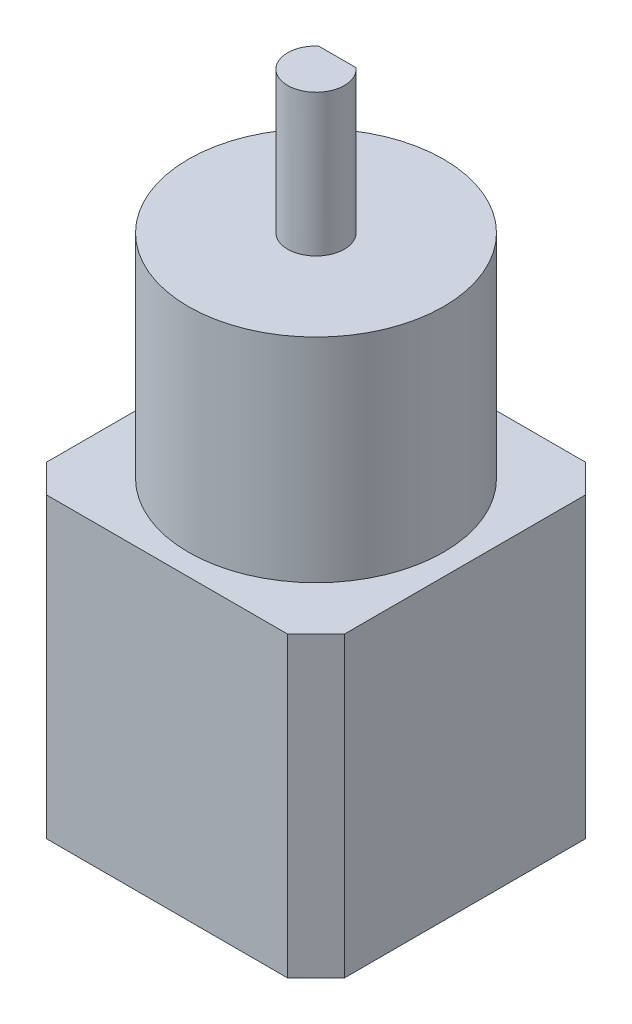
ISO-10303-21;
HEADER;
FILE_DESCRIPTION(('STEP AP214'),'2;1');
FILE_NAME('part.step','',(''),(''),'','','');
FILE_SCHEMA(('AUTOMOTIVE_DESIGN { 1 0 10303 214 1 1 1 1 }'));
ENDSEC;
DATA;
#1=APPLICATION_CONTEXT('core data for automotive mechanical design processes');
#2=APPLICATION_PROTOCOL_DEFINITION('international standard','automotive_design',2000,#1);
#3=PRODUCT_CONTEXT('',#1,'mechanical');
#4=PRODUCT('Part','Part','',(#3));
#5=PRODUCT_RELATED_PRODUCT_CATEGORY('part','',(#4));
#6=PRODUCT_DEFINITION_FORMATION('','',#4);
#7=PRODUCT_DEFINITION_CONTEXT('part definition',#1,'design');
#8=PRODUCT_DEFINITION('design','',#6,#7);
#9=PRODUCT_DEFINITION_SHAPE('','',#8);
#10=(LENGTH_UNIT() NAMED_UNIT(*) SI_UNIT(.MILLI.,.METRE.));
#11=(NAMED_UNIT(*) PLANE_ANGLE_UNIT() SI_UNIT($,.RADIAN.));
#12=(NAMED_UNIT(*) SI_UNIT($,.STERADIAN.) SOLID_ANGLE_UNIT());
#13=UNCERTAINTY_MEASURE_WITH_UNIT(LENGTH_MEASURE(1.E-05),#10,'distance_accuracy_value','');
#14=(GEOMETRIC_REPRESENTATION_CONTEXT(3) GLOBAL_UNCERTAINTY_ASSIGNED_CONTEXT((#13)) GLOBAL_UNIT_ASSIGNED_CONTEXT((#10,
#11,#12)) REPRESENTATION_CONTEXT('',''));
#15=CARTESIAN_POINT('',(0.,0.,0.));
#16=DIRECTION('',(0.,0.,1.));
#17=DIRECTION('',(1.,0.,0.));
#18=AXIS2_PLACEMENT_3D('',#15,#16,#17);
#19=CARTESIAN_POINT('',(21.,21.,21.));
#20=DIRECTION('',(-1.,0.,0.));
#21=DIRECTION('',(0.,0.,1.));
#22=AXIS2_PLACEMENT_3D('',#19,#20,#21);
#23=PLANE('',#22);
#24=DIRECTION('',(0.,0.,-1.));
#25=VECTOR('',#24,1.);
#26=CARTESIAN_POINT('',(21.,-21.,21.));
#27=LINE('',#26,#25);
#28=CARTESIAN_POINT('',(21.,-21.,17.));
#29=VERTEX_POINT('',#28);
#30=CARTESIAN_POINT('',(21.,-21.,-17.));
#31=VERTEX_POINT('',#30);
#32=EDGE_CURVE('E144',#29,#31,#27,.T.);
#33=ORIENTED_EDGE('',*,*,#32,.T.);
#34=DIRECTION('',(0.,1.,0.));
#35=VECTOR('',#34,1.);
#36=CARTESIAN_POINT('',(21.,21.,-17.));
#37=LINE('',#36,#35);
#38=CARTESIAN_POINT('',(21.,21.,-17.));
#39=VERTEX_POINT('',#38);
#40=EDGE_CURVE('E197',#31,#39,#37,.T.);
#41=ORIENTED_EDGE('',*,*,#40,.T.);
#42=DIRECTION('',(0.,0.,-1.));
#43=VECTOR('',#42,1.);
#44=CARTESIAN_POINT('',(21.,21.,21.));
#45=LINE('',#44,#43);
#46=CARTESIAN_POINT('',(21.,21.,17.));
#47=VERTEX_POINT('',#46);
#48=EDGE_CURVE('E147',#47,#39,#45,.T.);
#49=ORIENTED_EDGE('',*,*,#48,.F.);
#50=DIRECTION('',(0.,-1.,0.));
#51=VECTOR('',#50,1.);
#52=CARTESIAN_POINT('',(21.,21.,17.));
#53=LINE('',#52,#51);
#54=EDGE_CURVE('E194',#47,#29,#53,.T.);
#55=ORIENTED_EDGE('',*,*,#54,.T.);
#56=EDGE_LOOP('',(#33,#41,#49,#55));
#57=FACE_BOUND('',#56,.T.);
#58=ADVANCED_FACE('F38',(#57),#23,.F.);
#59=CARTESIAN_POINT('',(-21.,21.,-21.));
#60=DIRECTION('',(0.,0.,1.));
#61=DIRECTION('',(1.,0.,0.));
#62=AXIS2_PLACEMENT_3D('',#59,#60,#61);
#63=PLANE('',#62);
#64=DIRECTION('',(-1.,0.,0.));
#65=VECTOR('',#64,1.);
#66=CARTESIAN_POINT('',(-21.,-21.,-21.));
#67=LINE('',#66,#65);
#68=CARTESIAN_POINT('',(17.,-21.,-21.));
#69=VERTEX_POINT('',#68);
#70=CARTESIAN_POINT('',(-17.,-21.,-21.));
#71=VERTEX_POINT('',#70);
#72=EDGE_CURVE('E162',#69,#71,#67,.T.);
#73=ORIENTED_EDGE('',*,*,#72,.T.);
#74=DIRECTION('',(0.,1.,0.));
#75=VECTOR('',#74,1.);
#76=CARTESIAN_POINT('',(-17.,21.,-21.));
#77=LINE('',#76,#75);
#78=CARTESIAN_POINT('',(-17.,21.,-21.));
#79=VERTEX_POINT('',#78);
#80=EDGE_CURVE('E184',#71,#79,#77,.T.);
#81=ORIENTED_EDGE('',*,*,#80,.T.);
#82=DIRECTION('',(-1.,0.,0.));
#83=VECTOR('',#82,1.);
#84=CARTESIAN_POINT('',(-21.,21.,-21.));
#85=LINE('',#84,#83);
#86=CARTESIAN_POINT('',(17.,21.,-21.));
#87=VERTEX_POINT('',#86);
#88=EDGE_CURVE('E150',#87,#79,#85,.T.);
#89=ORIENTED_EDGE('',*,*,#88,.F.);
#90=DIRECTION('',(0.,-1.,0.));
#91=VECTOR('',#90,1.);
#92=CARTESIAN_POINT('',(17.,21.,-21.));
#93=LINE('',#92,#91);
#94=EDGE_CURVE('E181',#87,#69,#93,.T.);
#95=ORIENTED_EDGE('',*,*,#94,.T.);
#96=EDGE_LOOP('',(#73,#81,#89,#95));
#97=FACE_BOUND('',#96,.T.);
#98=ADVANCED_FACE('F223',(#97),#63,.F.);
#99=CARTESIAN_POINT('',(-21.,21.,21.));
#100=DIRECTION('',(1.,0.,0.));
#101=DIRECTION('',(0.,0.,-1.));
#102=AXIS2_PLACEMENT_3D('',#99,#100,#101);
#103=PLANE('',#102);
#104=DIRECTION('',(0.,0.,1.));
#105=VECTOR('',#104,1.);
#106=CARTESIAN_POINT('',(-21.,21.,21.));
#107=LINE('',#106,#105);
#108=CARTESIAN_POINT('',(-21.,21.,-17.));
#109=VERTEX_POINT('',#108);
#110=CARTESIAN_POINT('',(-21.,21.,17.));
#111=VERTEX_POINT('',#110);
#112=EDGE_CURVE('E154',#109,#111,#107,.T.);
#113=ORIENTED_EDGE('',*,*,#112,.F.);
#114=DIRECTION('',(0.,-1.,0.));
#115=VECTOR('',#114,1.);
#116=CARTESIAN_POINT('',(-21.,21.,-17.));
#117=LINE('',#116,#115);
#118=CARTESIAN_POINT('',(-21.,-21.,-17.));
#119=VERTEX_POINT('',#118);
#120=EDGE_CURVE('E170',#109,#119,#117,.T.);
#121=ORIENTED_EDGE('',*,*,#120,.T.);
#122=DIRECTION('',(0.,0.,1.));
#123=VECTOR('',#122,1.);
#124=CARTESIAN_POINT('',(-21.,-21.,21.));
#125=LINE('',#124,#123);
#126=CARTESIAN_POINT('',(-21.,-21.,17.));
#127=VERTEX_POINT('',#126);
#128=EDGE_CURVE('E165',#119,#127,#125,.T.);
#129=ORIENTED_EDGE('',*,*,#128,.T.);
#130=DIRECTION('',(0.,1.,0.));
#131=VECTOR('',#130,1.);
#132=CARTESIAN_POINT('',(-21.,21.,17.));
#133=LINE('',#132,#131);
#134=EDGE_CURVE('E159',#127,#111,#133,.T.);
#135=ORIENTED_EDGE('',*,*,#134,.T.);
#136=EDGE_LOOP('',(#113,#121,#129,#135));
#137=FACE_BOUND('',#136,.T.);
#138=ADVANCED_FACE('F231',(#137),#103,.F.);
#139=CARTESIAN_POINT('',(-21.,21.,21.));
#140=DIRECTION('',(0.,0.,-1.));
#141=DIRECTION('',(-1.,0.,0.));
#142=AXIS2_PLACEMENT_3D('',#139,#140,#141);
#143=PLANE('',#142);
#144=DIRECTION('',(1.,0.,0.));
#145=VECTOR('',#144,1.);
#146=CARTESIAN_POINT('',(-21.,21.,21.));
#147=LINE('',#146,#145);
#148=CARTESIAN_POINT('',(-17.,21.,21.));
#149=VERTEX_POINT('',#148);
#150=CARTESIAN_POINT('',(17.,21.,21.));
#151=VERTEX_POINT('',#150);
#152=EDGE_CURVE('E157',#149,#151,#147,.T.);
#153=ORIENTED_EDGE('',*,*,#152,.F.);
#154=DIRECTION('',(0.,-1.,0.));
#155=VECTOR('',#154,1.);
#156=CARTESIAN_POINT('',(-17.,21.,21.));
#157=LINE('',#156,#155);
#158=CARTESIAN_POINT('',(-17.,-21.,21.));
#159=VERTEX_POINT('',#158);
#160=EDGE_CURVE('E43',#149,#159,#157,.T.);
#161=ORIENTED_EDGE('',*,*,#160,.T.);
#162=DIRECTION('',(1.,0.,0.));
#163=VECTOR('',#162,1.);
#164=CARTESIAN_POINT('',(-21.,-21.,21.));
#165=LINE('',#164,#163);
#166=CARTESIAN_POINT('',(17.,-21.,21.));
#167=VERTEX_POINT('',#166);
#168=EDGE_CURVE('E151',#159,#167,#165,.T.);
#169=ORIENTED_EDGE('',*,*,#168,.T.);
#170=DIRECTION('',(0.,1.,0.));
#171=VECTOR('',#170,1.);
#172=CARTESIAN_POINT('',(17.,21.,21.));
#173=LINE('',#172,#171);
#174=EDGE_CURVE('E64',#167,#151,#173,.T.);
#175=ORIENTED_EDGE('',*,*,#174,.T.);
#176=EDGE_LOOP('',(#153,#161,#169,#175));
#177=FACE_BOUND('',#176,.T.);
#178=ADVANCED_FACE('F201',(#177),#143,.F.);
#179=CARTESIAN_POINT('',(0.,21.,0.));
#180=DIRECTION('',(0.,-1.,0.));
#181=DIRECTION('',(0.,0.,-1.));
#182=AXIS2_PLACEMENT_3D('',#179,#180,#181);
#183=PLANE('',#182);
#184=CARTESIAN_POINT('',(0.,21.,0.));
#185=DIRECTION('',(0.,1.,0.));
#186=DIRECTION('',(0.,0.,1.));
#187=AXIS2_PLACEMENT_3D('',#184,#185,#186);
#188=CIRCLE('',#187,18.);
#189=CARTESIAN_POINT('',(0.,21.,18.));
#190=VERTEX_POINT('',#189);
#191=EDGE_CURVE('E48',#190,#190,#188,.T.);
#192=ORIENTED_EDGE('',*,*,#191,.F.);
#193=EDGE_LOOP('',(#192));
#194=FACE_BOUND('',#193,.T.);
#195=ORIENTED_EDGE('',*,*,#88,.T.);
#196=DIRECTION('',(0.707106781186549,0.,-0.707106781186546));
#197=VECTOR('',#196,1.);
#198=CARTESIAN_POINT('',(-21.,21.,-17.));
#199=LINE('',#198,#197);
#200=EDGE_CURVE('E192',#79,#109,#199,.F.);
#201=ORIENTED_EDGE('',*,*,#200,.T.);
#202=ORIENTED_EDGE('',*,*,#112,.T.);
#203=DIRECTION('',(-0.707106781186546,0.,-0.707106781186549));
#204=VECTOR('',#203,1.);
#205=CARTESIAN_POINT('',(-17.,21.,21.));
#206=LINE('',#205,#204);
#207=EDGE_CURVE('E188',#111,#149,#206,.F.);
#208=ORIENTED_EDGE('',*,*,#207,.T.);
#209=ORIENTED_EDGE('',*,*,#152,.T.);
#210=DIRECTION('',(-0.707106781186548,0.,0.707106781186547));
#211=VECTOR('',#210,1.);
#212=CARTESIAN_POINT('',(21.,21.,17.));
#213=LINE('',#212,#211);
#214=EDGE_CURVE('E186',#151,#47,#213,.F.);
#215=ORIENTED_EDGE('',*,*,#214,.T.);
#216=ORIENTED_EDGE('',*,*,#48,.T.);
#217=DIRECTION('',(0.707106781186546,0.,0.707106781186549));
#218=VECTOR('',#217,1.);
#219=CARTESIAN_POINT('',(17.,21.,-21.));
#220=LINE('',#219,#218);
#221=EDGE_CURVE('E190',#39,#87,#220,.F.);
#222=ORIENTED_EDGE('',*,*,#221,.T.);
#223=EDGE_LOOP('',(#195,#201,#202,#208,#209,#215,#216,#222));
#224=FACE_BOUND('',#223,.T.);
#225=ADVANCED_FACE('F216',(#194,#224),#183,.F.);
#226=CARTESIAN_POINT('',(0.,-21.,0.));
#227=DIRECTION('',(0.,-1.,0.));
#228=DIRECTION('',(0.,0.,-1.));
#229=AXIS2_PLACEMENT_3D('',#226,#227,#228);
#230=PLANE('',#229);
#231=ORIENTED_EDGE('',*,*,#128,.F.);
#232=DIRECTION('',(-0.707106781186549,0.,0.707106781186546));
#233=VECTOR('',#232,1.);
#234=CARTESIAN_POINT('',(-19.,-21.,-19.));
#235=LINE('',#234,#233);
#236=EDGE_CURVE('E179',#119,#71,#235,.F.);
#237=ORIENTED_EDGE('',*,*,#236,.T.);
#238=ORIENTED_EDGE('',*,*,#72,.F.);
#239=DIRECTION('',(-0.707106781186546,0.,-0.707106781186549));
#240=VECTOR('',#239,1.);
#241=CARTESIAN_POINT('',(19.,-21.,-18.9999999999999));
#242=LINE('',#241,#240);
#243=EDGE_CURVE('E177',#69,#31,#242,.F.);
#244=ORIENTED_EDGE('',*,*,#243,.T.);
#245=ORIENTED_EDGE('',*,*,#32,.F.);
#246=DIRECTION('',(0.707106781186548,0.,-0.707106781186547));
#247=VECTOR('',#246,1.);
#248=CARTESIAN_POINT('',(19.,-21.,19.));
#249=LINE('',#248,#247);
#250=EDGE_CURVE('E173',#29,#167,#249,.F.);
#251=ORIENTED_EDGE('',*,*,#250,.T.);
#252=ORIENTED_EDGE('',*,*,#168,.F.);
#253=DIRECTION('',(0.707106781186546,0.,0.707106781186549));
#254=VECTOR('',#253,1.);
#255=CARTESIAN_POINT('',(-19.,-21.,19.));
#256=LINE('',#255,#254);
#257=EDGE_CURVE('E175',#159,#127,#256,.F.);
#258=ORIENTED_EDGE('',*,*,#257,.T.);
#259=EDGE_LOOP('',(#231,#237,#238,#244,#245,#251,#252,#258));
#260=FACE_BOUND('',#259,.T.);
#261=ADVANCED_FACE('F206',(#260),#230,.T.);
#262=CARTESIAN_POINT('',(-21.,21.,-17.));
#263=DIRECTION('',(0.707106781186546,0.,0.707106781186549));
#264=DIRECTION('',(0.,-1.,0.));
#265=AXIS2_PLACEMENT_3D('',#262,#263,#264);
#266=PLANE('',#265);
#267=ORIENTED_EDGE('',*,*,#200,.F.);
#268=ORIENTED_EDGE('',*,*,#80,.F.);
#269=ORIENTED_EDGE('',*,*,#236,.F.);
#270=ORIENTED_EDGE('',*,*,#120,.F.);
#271=EDGE_LOOP('',(#267,#268,#269,#270));
#272=FACE_BOUND('',#271,.T.);
#273=ADVANCED_FACE('F228',(#272),#266,.F.);
#274=CARTESIAN_POINT('',(17.,21.,-21.));
#275=DIRECTION('',(-0.707106781186549,0.,0.707106781186546));
#276=DIRECTION('',(0.,-1.,0.));
#277=AXIS2_PLACEMENT_3D('',#274,#275,#276);
#278=PLANE('',#277);
#279=ORIENTED_EDGE('',*,*,#221,.F.);
#280=ORIENTED_EDGE('',*,*,#40,.F.);
#281=ORIENTED_EDGE('',*,*,#243,.F.);
#282=ORIENTED_EDGE('',*,*,#94,.F.);
#283=EDGE_LOOP('',(#279,#280,#281,#282));
#284=FACE_BOUND('',#283,.T.);
#285=ADVANCED_FACE('F220',(#284),#278,.F.);
#286=CARTESIAN_POINT('',(-17.,21.,21.));
#287=DIRECTION('',(0.707106781186549,0.,-0.707106781186546));
#288=DIRECTION('',(0.,-1.,0.));
#289=AXIS2_PLACEMENT_3D('',#286,#287,#288);
#290=PLANE('',#289);
#291=ORIENTED_EDGE('',*,*,#207,.F.);
#292=ORIENTED_EDGE('',*,*,#134,.F.);
#293=ORIENTED_EDGE('',*,*,#257,.F.);
#294=ORIENTED_EDGE('',*,*,#160,.F.);
#295=EDGE_LOOP('',(#291,#292,#293,#294));
#296=FACE_BOUND('',#295,.T.);
#297=ADVANCED_FACE('F233',(#296),#290,.F.);
#298=CARTESIAN_POINT('',(21.,21.,17.));
#299=DIRECTION('',(-0.707106781186547,0.,-0.707106781186548));
#300=DIRECTION('',(0.,-1.,0.));
#301=AXIS2_PLACEMENT_3D('',#298,#299,#300);
#302=PLANE('',#301);
#303=ORIENTED_EDGE('',*,*,#214,.F.);
#304=ORIENTED_EDGE('',*,*,#174,.F.);
#305=ORIENTED_EDGE('',*,*,#250,.F.);
#306=ORIENTED_EDGE('',*,*,#54,.F.);
#307=EDGE_LOOP('',(#303,#304,#305,#306));
#308=FACE_BOUND('',#307,.T.);
#309=ADVANCED_FACE('F41',(#308),#302,.F.);
#310=CARTESIAN_POINT('',(0.,51.,0.));
#311=DIRECTION('',(0.,-1.,0.));
#312=DIRECTION('',(0.,0.,-1.));
#313=AXIS2_PLACEMENT_3D('',#310,#311,#312);
#314=CYLINDRICAL_SURFACE('',#313,18.);
#315=CARTESIAN_POINT('',(0.,51.,0.));
#316=DIRECTION('',(0.,1.,0.));
#317=DIRECTION('',(0.,0.,1.));
#318=AXIS2_PLACEMENT_3D('',#315,#316,#317);
#319=CIRCLE('',#318,18.);
#320=CARTESIAN_POINT('',(0.,51.,18.));
#321=VERTEX_POINT('',#320);
#322=EDGE_CURVE('E140',#321,#321,#319,.T.);
#323=ORIENTED_EDGE('',*,*,#322,.F.);
#324=EDGE_LOOP('',(#323));
#325=FACE_BOUND('',#324,.T.);
#326=ORIENTED_EDGE('',*,*,#191,.T.);
#327=EDGE_LOOP('',(#326));
#328=FACE_BOUND('',#327,.T.);
#329=ADVANCED_FACE('F239',(#325,#328),#314,.T.);
#330=CARTESIAN_POINT('',(0.,51.,0.));
#331=DIRECTION('',(0.,1.,0.));
#332=DIRECTION('',(0.,0.,1.));
#333=AXIS2_PLACEMENT_3D('',#330,#331,#332);
#334=PLANE('',#333);
#335=CARTESIAN_POINT('',(0.,51.,0.));
#336=DIRECTION('',(0.,1.,0.));
#337=DIRECTION('',(0.,0.,1.));
#338=AXIS2_PLACEMENT_3D('',#335,#336,#337);
#339=CIRCLE('',#338,4.);
#340=CARTESIAN_POINT('',(0.,51.,4.));
#341=VERTEX_POINT('',#340);
#342=EDGE_CURVE('E11',#341,#341,#339,.T.);
#343=ORIENTED_EDGE('',*,*,#342,.F.);
#344=EDGE_LOOP('',(#343));
#345=FACE_BOUND('',#344,.T.);
#346=ORIENTED_EDGE('',*,*,#322,.T.);
#347=EDGE_LOOP('',(#346));
#348=FACE_BOUND('',#347,.T.);
#349=ADVANCED_FACE('F299',(#345,#348),#334,.T.);
#350=CARTESIAN_POINT('',(0.,71.,0.));
#351=DIRECTION('',(0.,-1.,0.));
#352=DIRECTION('',(0.,0.,-1.));
#353=AXIS2_PLACEMENT_3D('',#350,#351,#352);
#354=CYLINDRICAL_SURFACE('',#353,4.);
#355=CARTESIAN_POINT('',(0.,71.,0.));
#356=DIRECTION('',(0.,1.,0.));
#357=DIRECTION('',(0.,0.,1.));
#358=AXIS2_PLACEMENT_3D('',#355,#356,#357);
#359=CIRCLE('',#358,4.);
#360=CARTESIAN_POINT('',(-2.64575131106459,71.,-3.));
#361=VERTEX_POINT('',#360);
#362=CARTESIAN_POINT('',(2.64575131106459,71.,-3.));
#363=VERTEX_POINT('',#362);
#364=EDGE_CURVE('E135',#361,#363,#359,.T.);
#365=ORIENTED_EDGE('',*,*,#364,.F.);
#366=DIRECTION('',(0.,1.,0.));
#367=VECTOR('',#366,1.);
#368=CARTESIAN_POINT('',(-2.64575131106459,56.,-3.));
#369=LINE('',#368,#367);
#370=CARTESIAN_POINT('',(-2.64575131106459,56.,-3.));
#371=VERTEX_POINT('',#370);
#372=EDGE_CURVE('E56',#371,#361,#369,.T.);
#373=ORIENTED_EDGE('',*,*,#372,.F.);
#374=CARTESIAN_POINT('',(0.,56.,0.));
#375=DIRECTION('',(0.,1.,0.));
#376=DIRECTION('',(0.,0.,-1.));
#377=AXIS2_PLACEMENT_3D('',#374,#375,#376);
#378=CIRCLE('',#377,4.);
#379=CARTESIAN_POINT('',(2.64575131106459,56.,-3.));
#380=VERTEX_POINT('',#379);
#381=EDGE_CURVE('E121',#380,#371,#378,.T.);
#382=ORIENTED_EDGE('',*,*,#381,.F.);
#383=DIRECTION('',(0.,1.,0.));
#384=VECTOR('',#383,1.);
#385=CARTESIAN_POINT('',(2.64575131106459,56.,-3.));
#386=LINE('',#385,#384);
#387=EDGE_CURVE('E129',#380,#363,#386,.T.);
#388=ORIENTED_EDGE('',*,*,#387,.T.);
#389=EDGE_LOOP('',(#365,#373,#382,#388));
#390=FACE_BOUND('',#389,.T.);
#391=ORIENTED_EDGE('',*,*,#342,.T.);
#392=EDGE_LOOP('',(#391));
#393=FACE_BOUND('',#392,.T.);
#394=ADVANCED_FACE('F132',(#390,#393),#354,.T.);
#395=CARTESIAN_POINT('',(0.,71.,0.));
#396=DIRECTION('',(0.,1.,0.));
#397=DIRECTION('',(0.,0.,1.));
#398=AXIS2_PLACEMENT_3D('',#395,#396,#397);
#399=PLANE('',#398);
#400=DIRECTION('',(1.,0.,0.));
#401=VECTOR('',#400,1.);
#402=CARTESIAN_POINT('',(-2.64575131106459,71.,-3.));
#403=LINE('',#402,#401);
#404=EDGE_CURVE('E126',#361,#363,#403,.T.);
#405=ORIENTED_EDGE('',*,*,#404,.F.);
#406=ORIENTED_EDGE('',*,*,#364,.T.);
#407=EDGE_LOOP('',(#405,#406));
#408=FACE_BOUND('',#407,.T.);
#409=ADVANCED_FACE('F317',(#408),#399,.T.);
#410=CARTESIAN_POINT('',(-2.64575131106459,56.,-3.));
#411=DIRECTION('',(0.,0.,1.));
#412=DIRECTION('',(1.,0.,0.));
#413=AXIS2_PLACEMENT_3D('',#410,#411,#412);
#414=PLANE('',#413);
#415=ORIENTED_EDGE('',*,*,#404,.T.);
#416=ORIENTED_EDGE('',*,*,#387,.F.);
#417=DIRECTION('',(1.,0.,0.));
#418=VECTOR('',#417,1.);
#419=CARTESIAN_POINT('',(-2.64575131106459,56.,-3.));
#420=LINE('',#419,#418);
#421=EDGE_CURVE('E123',#371,#380,#420,.T.);
#422=ORIENTED_EDGE('',*,*,#421,.F.);
#423=ORIENTED_EDGE('',*,*,#372,.T.);
#424=EDGE_LOOP('',(#415,#416,#422,#423));
#425=FACE_BOUND('',#424,.T.);
#426=ADVANCED_FACE('F128',(#425),#414,.F.);
#427=CARTESIAN_POINT('',(0.,56.,0.));
#428=DIRECTION('',(0.,-1.,0.));
#429=DIRECTION('',(0.,0.,-1.));
#430=AXIS2_PLACEMENT_3D('',#427,#428,#429);
#431=PLANE('',#430);
#432=ORIENTED_EDGE('',*,*,#381,.T.);
#433=ORIENTED_EDGE('',*,*,#421,.T.);
#434=EDGE_LOOP('',(#432,#433));
#435=FACE_BOUND('',#434,.T.);
#436=ADVANCED_FACE('F122',(#435),#431,.F.);
#437=CLOSED_SHELL('',(#58,#98,#138,#178,#225,#261,#273,#285,#297,#309,#329,#349,#394,#409,#426,#436));
#438=MANIFOLD_SOLID_BREP('B2',#437);
#439=ADVANCED_BREP_SHAPE_REPRESENTATION('',(#18,#438),#14);
#440=SHAPE_DEFINITION_REPRESENTATION(#9,#439);
ENDSEC;
END-ISO-10303-21;
